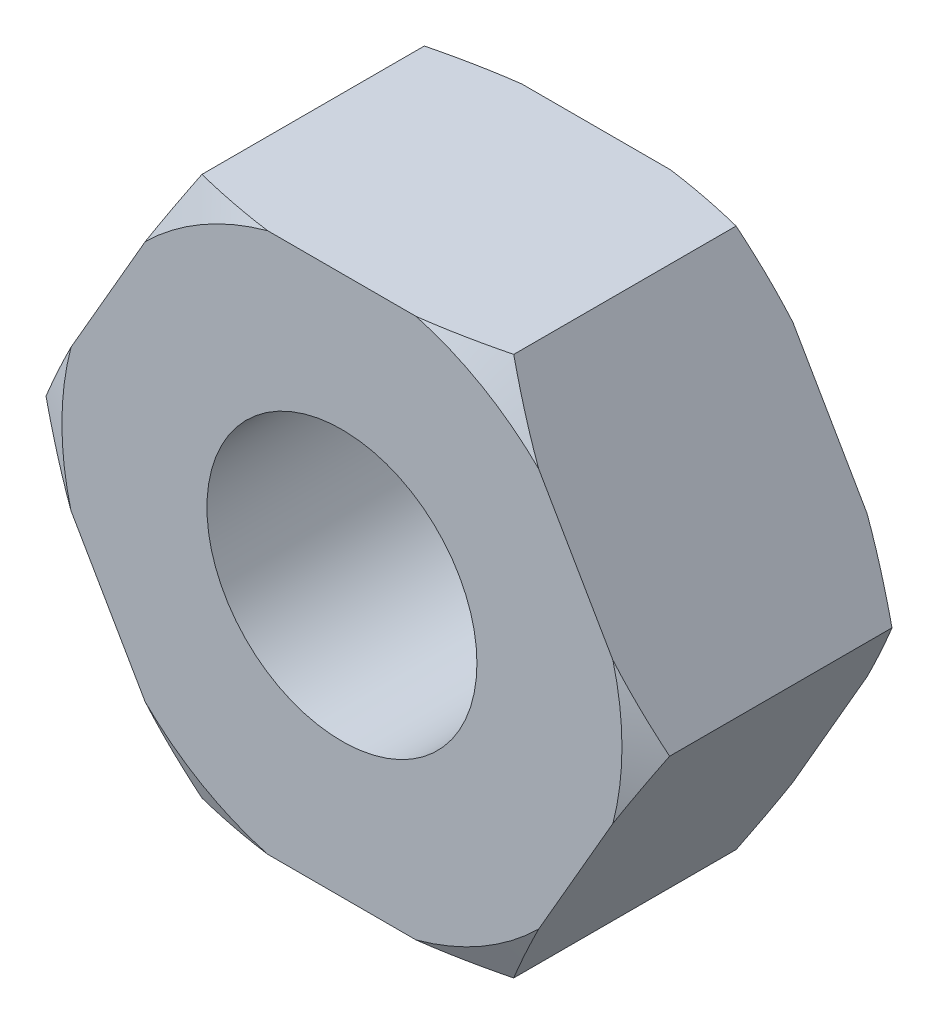
ISO-10303-21;
HEADER;
FILE_DESCRIPTION(('STEP AP214'),'2;1');
FILE_NAME('part.step','',(''),(''),'','','');
FILE_SCHEMA(('AUTOMOTIVE_DESIGN { 1 0 10303 214 1 1 1 1 }'));
ENDSEC;
DATA;
#1=APPLICATION_CONTEXT('core data for automotive mechanical design processes');
#2=APPLICATION_PROTOCOL_DEFINITION('international standard','automotive_design',2000,#1);
#3=PRODUCT_CONTEXT('',#1,'mechanical');
#4=PRODUCT('Part','Part','',(#3));
#5=PRODUCT_RELATED_PRODUCT_CATEGORY('part','',(#4));
#6=PRODUCT_DEFINITION_FORMATION('','',#4);
#7=PRODUCT_DEFINITION_CONTEXT('part definition',#1,'design');
#8=PRODUCT_DEFINITION('design','',#6,#7);
#9=PRODUCT_DEFINITION_SHAPE('','',#8);
#10=(LENGTH_UNIT() NAMED_UNIT(*) SI_UNIT(.MILLI.,.METRE.));
#11=(NAMED_UNIT(*) PLANE_ANGLE_UNIT() SI_UNIT($,.RADIAN.));
#12=(NAMED_UNIT(*) SI_UNIT($,.STERADIAN.) SOLID_ANGLE_UNIT());
#13=UNCERTAINTY_MEASURE_WITH_UNIT(LENGTH_MEASURE(1.E-05),#10,'distance_accuracy_value','');
#14=(GEOMETRIC_REPRESENTATION_CONTEXT(3) GLOBAL_UNCERTAINTY_ASSIGNED_CONTEXT((#13)) GLOBAL_UNIT_ASSIGNED_CONTEXT((#10,
#11,#12)) REPRESENTATION_CONTEXT('',''));
#15=CARTESIAN_POINT('',(0.,0.,0.));
#16=DIRECTION('',(0.,0.,1.));
#17=DIRECTION('',(1.,0.,0.));
#18=AXIS2_PLACEMENT_3D('',#15,#16,#17);
#19=CARTESIAN_POINT('',(0.,0.,8.));
#20=DIRECTION('',(0.,0.,1.));
#21=DIRECTION('',(1.,0.,0.));
#22=AXIS2_PLACEMENT_3D('',#19,#20,#21);
#23=PLANE('',#22);
#24=CARTESIAN_POINT('',(0.,0.,8.));
#25=DIRECTION('',(0.,0.,1.));
#26=DIRECTION('',(1.,0.,0.));
#27=AXIS2_PLACEMENT_3D('',#24,#25,#26);
#28=CIRCLE('',#27,4.25);
#29=CARTESIAN_POINT('',(4.25,0.,8.));
#30=VERTEX_POINT('',#29);
#31=EDGE_CURVE('E308',#30,#30,#28,.T.);
#32=ORIENTED_EDGE('',*,*,#31,.F.);
#33=EDGE_LOOP('',(#32));
#34=FACE_BOUND('',#33,.T.);
#35=CARTESIAN_POINT('',(0.,0.,8.00000000000001));
#36=DIRECTION('',(0.,0.,-1.));
#37=DIRECTION('',(-1.,0.,0.));
#38=AXIS2_PLACEMENT_3D('',#35,#36,#37);
#39=CIRCLE('',#38,8.81495457622364);
#40=CARTESIAN_POINT('',(6.19358754726888,-6.2723916870044,8.00000000000001));
#41=VERTEX_POINT('',#40);
#42=CARTESIAN_POINT('',(2.33525676979774,-8.50000000000001,8.));
#43=VERTEX_POINT('',#42);
#44=EDGE_CURVE('E174',#41,#43,#39,.T.);
#45=ORIENTED_EDGE('',*,*,#44,.F.);
#46=DIRECTION('',(0.5,0.866025403784439,0.));
#47=VECTOR('',#46,1.);
#48=CARTESIAN_POINT('',(4.90747728811182,-8.50000000000001,8.));
#49=LINE('',#48,#47);
#50=CARTESIAN_POINT('',(8.52884431706658,-2.2276083129956,8.00000000000001));
#51=VERTEX_POINT('',#50);
#52=EDGE_CURVE('E186',#41,#51,#49,.T.);
#53=ORIENTED_EDGE('',*,*,#52,.T.);
#54=CARTESIAN_POINT('',(8.52884431706658,2.22760831299561,8.00000000000001));
#55=VERTEX_POINT('',#54);
#56=EDGE_CURVE('E367',#55,#51,#39,.T.);
#57=ORIENTED_EDGE('',*,*,#56,.F.);
#58=DIRECTION('',(-0.5,0.866025403784439,0.));
#59=VECTOR('',#58,1.);
#60=CARTESIAN_POINT('',(9.81495457622364,0.,8.));
#61=LINE('',#60,#59);
#62=CARTESIAN_POINT('',(6.19358754726888,6.2723916870044,8.00000000000001));
#63=VERTEX_POINT('',#62);
#64=EDGE_CURVE('E317',#55,#63,#61,.T.);
#65=ORIENTED_EDGE('',*,*,#64,.T.);
#66=CARTESIAN_POINT('',(2.33525676979768,8.50000000000001,8.00000000000001));
#67=VERTEX_POINT('',#66);
#68=EDGE_CURVE('E364',#67,#63,#39,.T.);
#69=ORIENTED_EDGE('',*,*,#68,.F.);
#70=DIRECTION('',(-1.,0.,0.));
#71=VECTOR('',#70,1.);
#72=CARTESIAN_POINT('',(4.90747728811181,8.50000000000001,8.));
#73=LINE('',#72,#71);
#74=CARTESIAN_POINT('',(-2.33525676979769,8.50000000000001,8.));
#75=VERTEX_POINT('',#74);
#76=EDGE_CURVE('E320',#67,#75,#73,.T.);
#77=ORIENTED_EDGE('',*,*,#76,.T.);
#78=CARTESIAN_POINT('',(-6.19358754726888,6.27239168700441,8.));
#79=VERTEX_POINT('',#78);
#80=EDGE_CURVE('E357',#79,#75,#39,.T.);
#81=ORIENTED_EDGE('',*,*,#80,.F.);
#82=DIRECTION('',(-0.5,-0.866025403784439,0.));
#83=VECTOR('',#82,1.);
#84=CARTESIAN_POINT('',(-4.90747728811182,8.50000000000001,8.));
#85=LINE('',#84,#83);
#86=CARTESIAN_POINT('',(-8.52884431706659,2.22760831299559,8.));
#87=VERTEX_POINT('',#86);
#88=EDGE_CURVE('E323',#79,#87,#85,.T.);
#89=ORIENTED_EDGE('',*,*,#88,.T.);
#90=CARTESIAN_POINT('',(-8.5288443170666,-2.22760831299559,8.));
#91=VERTEX_POINT('',#90);
#92=EDGE_CURVE('E359',#91,#87,#39,.T.);
#93=ORIENTED_EDGE('',*,*,#92,.F.);
#94=DIRECTION('',(0.5,-0.866025403784439,0.));
#95=VECTOR('',#94,1.);
#96=CARTESIAN_POINT('',(-9.81495457622365,0.,8.));
#97=LINE('',#96,#95);
#98=CARTESIAN_POINT('',(-6.19358754726887,-6.27239168700442,8.));
#99=VERTEX_POINT('',#98);
#100=EDGE_CURVE('E199',#91,#99,#97,.T.);
#101=ORIENTED_EDGE('',*,*,#100,.T.);
#102=CARTESIAN_POINT('',(-2.33525676979771,-8.50000000000001,8.));
#103=VERTEX_POINT('',#102);
#104=EDGE_CURVE('E360',#103,#99,#39,.T.);
#105=ORIENTED_EDGE('',*,*,#104,.F.);
#106=DIRECTION('',(1.,0.,0.));
#107=VECTOR('',#106,1.);
#108=CARTESIAN_POINT('',(-4.90747728811182,-8.50000000000001,8.));
#109=LINE('',#108,#107);
#110=EDGE_CURVE('E195',#103,#43,#109,.T.);
#111=ORIENTED_EDGE('',*,*,#110,.T.);
#112=EDGE_LOOP('',(#45,#53,#57,#65,#69,#77,#81,#89,#93,#101,#105,#111));
#113=FACE_BOUND('',#112,.T.);
#114=ADVANCED_FACE('F38',(#34,#113),#23,.T.);
#115=CARTESIAN_POINT('',(0.,0.,0.));
#116=DIRECTION('',(0.,0.,1.));
#117=DIRECTION('',(1.,0.,0.));
#118=AXIS2_PLACEMENT_3D('',#115,#116,#117);
#119=PLANE('',#118);
#120=CARTESIAN_POINT('',(0.,0.,0.));
#121=DIRECTION('',(0.,0.,1.));
#122=DIRECTION('',(1.,0.,0.));
#123=AXIS2_PLACEMENT_3D('',#120,#121,#122);
#124=CIRCLE('',#123,4.25);
#125=CARTESIAN_POINT('',(4.25,0.,0.));
#126=VERTEX_POINT('',#125);
#127=EDGE_CURVE('E312',#126,#126,#124,.T.);
#128=ORIENTED_EDGE('',*,*,#127,.T.);
#129=EDGE_LOOP('',(#128));
#130=FACE_BOUND('',#129,.T.);
#131=DIRECTION('',(0.5,0.866025403784439,0.));
#132=VECTOR('',#131,1.);
#133=CARTESIAN_POINT('',(4.90747728811182,-8.50000000000001,0.));
#134=LINE('',#133,#132);
#135=CARTESIAN_POINT('',(6.19358754726887,-6.27239168700442,0.));
#136=VERTEX_POINT('',#135);
#137=CARTESIAN_POINT('',(8.5288443170666,-2.22760831299558,0.));
#138=VERTEX_POINT('',#137);
#139=EDGE_CURVE('E311',#136,#138,#134,.T.);
#140=ORIENTED_EDGE('',*,*,#139,.F.);
#141=CARTESIAN_POINT('',(0.,0.,0.));
#142=DIRECTION('',(0.,0.,-1.));
#143=DIRECTION('',(-1.,0.,0.));
#144=AXIS2_PLACEMENT_3D('',#141,#142,#143);
#145=CIRCLE('',#144,8.81495457622364);
#146=CARTESIAN_POINT('',(2.33525676979771,-8.50000000000001,0.));
#147=VERTEX_POINT('',#146);
#148=EDGE_CURVE('E351',#136,#147,#145,.T.);
#149=ORIENTED_EDGE('',*,*,#148,.T.);
#150=DIRECTION('',(1.,0.,0.));
#151=VECTOR('',#150,1.);
#152=CARTESIAN_POINT('',(-4.90747728811182,-8.50000000000001,0.));
#153=LINE('',#152,#151);
#154=CARTESIAN_POINT('',(-2.33525676979769,-8.50000000000001,0.));
#155=VERTEX_POINT('',#154);
#156=EDGE_CURVE('E202',#155,#147,#153,.T.);
#157=ORIENTED_EDGE('',*,*,#156,.F.);
#158=CARTESIAN_POINT('',(-6.19358754726888,-6.27239168700441,0.));
#159=VERTEX_POINT('',#158);
#160=EDGE_CURVE('E350',#155,#159,#145,.T.);
#161=ORIENTED_EDGE('',*,*,#160,.T.);
#162=DIRECTION('',(0.5,-0.866025403784439,0.));
#163=VECTOR('',#162,1.);
#164=CARTESIAN_POINT('',(-9.81495457622365,0.,0.));
#165=LINE('',#164,#163);
#166=CARTESIAN_POINT('',(-8.52884431706659,-2.2276083129956,0.));
#167=VERTEX_POINT('',#166);
#168=EDGE_CURVE('E338',#167,#159,#165,.T.);
#169=ORIENTED_EDGE('',*,*,#168,.F.);
#170=CARTESIAN_POINT('',(-8.52884431706659,2.22760831299559,0.));
#171=VERTEX_POINT('',#170);
#172=EDGE_CURVE('E355',#167,#171,#145,.T.);
#173=ORIENTED_EDGE('',*,*,#172,.T.);
#174=DIRECTION('',(-0.5,-0.866025403784439,0.));
#175=VECTOR('',#174,1.);
#176=CARTESIAN_POINT('',(-4.90747728811182,8.50000000000001,0.));
#177=LINE('',#176,#175);
#178=CARTESIAN_POINT('',(-6.19358754726889,6.2723916870044,0.));
#179=VERTEX_POINT('',#178);
#180=EDGE_CURVE('E336',#179,#171,#177,.T.);
#181=ORIENTED_EDGE('',*,*,#180,.F.);
#182=CARTESIAN_POINT('',(-2.3352567697977,8.50000000000001,0.));
#183=VERTEX_POINT('',#182);
#184=EDGE_CURVE('E358',#179,#183,#145,.T.);
#185=ORIENTED_EDGE('',*,*,#184,.T.);
#186=DIRECTION('',(-1.,0.,0.));
#187=VECTOR('',#186,1.);
#188=CARTESIAN_POINT('',(4.90747728811181,8.50000000000001,0.));
#189=LINE('',#188,#187);
#190=CARTESIAN_POINT('',(2.33525676979765,8.50000000000001,0.));
#191=VERTEX_POINT('',#190);
#192=EDGE_CURVE('E333',#191,#183,#189,.T.);
#193=ORIENTED_EDGE('',*,*,#192,.F.);
#194=CARTESIAN_POINT('',(6.19358754726887,6.27239168700442,0.));
#195=VERTEX_POINT('',#194);
#196=EDGE_CURVE('E354',#191,#195,#145,.T.);
#197=ORIENTED_EDGE('',*,*,#196,.T.);
#198=DIRECTION('',(-0.5,0.866025403784439,0.));
#199=VECTOR('',#198,1.);
#200=CARTESIAN_POINT('',(9.81495457622364,0.,0.));
#201=LINE('',#200,#199);
#202=CARTESIAN_POINT('',(8.52884431706656,2.22760831299563,0.));
#203=VERTEX_POINT('',#202);
#204=EDGE_CURVE('E330',#203,#195,#201,.T.);
#205=ORIENTED_EDGE('',*,*,#204,.F.);
#206=EDGE_CURVE('E68',#203,#138,#145,.T.);
#207=ORIENTED_EDGE('',*,*,#206,.T.);
#208=EDGE_LOOP('',(#140,#149,#157,#161,#169,#173,#181,#185,#193,#197,#205,#207));
#209=FACE_BOUND('',#208,.T.);
#210=ADVANCED_FACE('F349',(#130,#209),#119,.F.);
#211=CARTESIAN_POINT('',(4.90747728811182,-8.50000000000001,8.));
#212=DIRECTION('',(-0.866025403784439,0.5,0.));
#213=DIRECTION('',(-0.5,-0.866025403784439,0.));
#214=AXIS2_PLACEMENT_3D('',#211,#212,#213);
#215=PLANE('',#214);
#216=DIRECTION('',(0.,0.,-1.));
#217=VECTOR('',#216,1.);
#218=CARTESIAN_POINT('',(4.90747728811182,-8.50000000000001,8.));
#219=LINE('',#218,#217);
#220=CARTESIAN_POINT('',(4.90747728811181,-8.50000000000001,7.50000000000001));
#221=VERTEX_POINT('',#220);
#222=CARTESIAN_POINT('',(4.90747728811182,-8.50000000000001,0.500000000000008));
#223=VERTEX_POINT('',#222);
#224=EDGE_CURVE('E184',#221,#223,#219,.T.);
#225=ORIENTED_EDGE('',*,*,#224,.T.);
#226=CARTESIAN_POINT('',(4.90707314292339,-8.50070000000001,0.500202085074665));
#227=CARTESIAN_POINT('',(5.04539648047619,-8.26111695148605,0.431037001478405));
#228=CARTESIAN_POINT('',(5.18425872801668,-8.02060048349272,0.365975934098768));
#229=CARTESIAN_POINT('',(5.46308933900149,-7.53765169856155,0.245431881458199));
#230=CARTESIAN_POINT('',(5.60305823357743,-7.29521846167677,0.189953829261579));
#231=CARTESIAN_POINT('',(5.88419637238107,-6.80827292132352,0.0899457379592984));
#232=CARTESIAN_POINT('',(6.02536708724475,-6.56375807063879,0.0454320334196543));
#233=CARTESIAN_POINT('',(6.30853248030509,-6.07330122291309,-0.0311688340336334));
#234=CARTESIAN_POINT('',(6.45052701218298,-5.82735947930363,-0.0632581389788533));
#235=CARTESIAN_POINT('',(6.73189823105368,-5.34001023243198,-0.11331637906808));
#236=CARTESIAN_POINT('',(6.87126127251055,-5.09862636393136,-0.131588987679449));
#237=CARTESIAN_POINT('',(7.15027760794049,-4.61535589482501,-0.154517426261992));
#238=CARTESIAN_POINT('',(7.28993091588691,-4.37346927001675,-0.159172584752798));
#239=CARTESIAN_POINT('',(7.56903063475875,-3.89005437655254,-0.154685571909243));
#240=CARTESIAN_POINT('',(7.70847710644293,-3.64852600265932,-0.14555826683455));
#241=CARTESIAN_POINT('',(7.98697270856631,-3.16615747009714,-0.113885574611613));
#242=CARTESIAN_POINT('',(8.12602187186108,-2.92531725452065,-0.0913413312657181));
#243=CARTESIAN_POINT('',(8.39475560713558,-2.45985677131747,-0.0354617719109811));
#244=CARTESIAN_POINT('',(8.5244805500039,-2.23516657926055,-0.00289193103305048));
#245=CARTESIAN_POINT('',(8.78320155681667,-1.78704865047547,0.0723911259197453));
#246=CARTESIAN_POINT('',(8.91219754131855,-1.56362105134584,0.11510542652468));
#247=CARTESIAN_POINT('',(9.17078093553375,-1.1157414745715,0.210140846061151));
#248=CARTESIAN_POINT('',(9.30035889198646,-0.891305870454461,0.262563810605358));
#249=CARTESIAN_POINT('',(9.55856371514588,-0.444081997983018,0.375552841414268));
#250=CARTESIAN_POINT('',(9.6871909974297,-0.221293009827922,0.436115096597846));
#251=CARTESIAN_POINT('',(9.81535872141207,0.000700000000001366,0.500202085074664));
#252=B_SPLINE_CURVE_WITH_KNOTS('',3,(#226,#227,#228,#229,#230,#231,#232,#233,#234,#235,#236,
#237,#238,#239,#240,#241,#242,#243,#244,#245,#246,#247,#248,#249,#250,#251),.UNSPECIFIED.,.F.,
.F.,(4,2,2,2,2,2,2,2,2,2,2,2,4),(0.,0.855528802068651,1.71149670206994,2.5687322038918,
3.42581984794331,4.26347350481425,5.10116846593084,5.93796050441603,6.774681216075,
7.55892436859344,8.34325140122732,9.13632729979293,9.92903313979551),.UNSPECIFIED.);
#253=EDGE_CURVE('E377',#223,#136,#252,.T.);
#254=ORIENTED_EDGE('',*,*,#253,.T.);
#255=ORIENTED_EDGE('',*,*,#139,.T.);
#256=CARTESIAN_POINT('',(9.81495457622365,0.,0.500000000000011));
#257=VERTEX_POINT('',#256);
#258=EDGE_CURVE('E315',#138,#257,#252,.T.);
#259=ORIENTED_EDGE('',*,*,#258,.T.);
#260=DIRECTION('',(0.,0.,-1.));
#261=VECTOR('',#260,1.);
#262=CARTESIAN_POINT('',(9.81495457622364,0.,8.));
#263=LINE('',#262,#261);
#264=CARTESIAN_POINT('',(9.81495457622364,0.,7.50000000000001));
#265=VERTEX_POINT('',#264);
#266=EDGE_CURVE('E213',#265,#257,#263,.T.);
#267=ORIENTED_EDGE('',*,*,#266,.F.);
#268=CARTESIAN_POINT('',(9.81535872141207,0.000700000000001828,7.49979791492535));
#269=CARTESIAN_POINT('',(9.67703538385927,-0.238883048513955,7.56896299852161));
#270=CARTESIAN_POINT('',(9.53817313631878,-0.479399516507294,7.63402406590125));
#271=CARTESIAN_POINT('',(9.25934252533396,-0.962348301438463,7.75456811854182));
#272=CARTESIAN_POINT('',(9.11937363075803,-1.20478153832324,7.81004617073844));
#273=CARTESIAN_POINT('',(8.83823549195439,-1.69172707867649,7.91005426204072));
#274=CARTESIAN_POINT('',(8.6970647770907,-1.93624192936122,7.95456796658036));
#275=CARTESIAN_POINT('',(8.41389938403037,-2.42669877708692,8.03116883403365));
#276=CARTESIAN_POINT('',(8.27190485215248,-2.67264052069639,8.06325813897887));
#277=CARTESIAN_POINT('',(7.99053363328177,-3.15998976756804,8.1133163790681));
#278=CARTESIAN_POINT('',(7.8511705918249,-3.40137363606866,8.13158898767946));
#279=CARTESIAN_POINT('',(7.57215425639496,-3.884644105175,8.15451742626201));
#280=CARTESIAN_POINT('',(7.43250094844854,-4.12653072998326,8.15917258475281));
#281=CARTESIAN_POINT('',(7.1534012295767,-4.60994562344748,8.15468557190925));
#282=CARTESIAN_POINT('',(7.01395475789252,-4.85147399734069,8.14555826683456));
#283=CARTESIAN_POINT('',(6.73545915576914,-5.33384252990287,8.11388557461163));
#284=CARTESIAN_POINT('',(6.59640999247437,-5.57468274547936,8.09134133126573));
#285=CARTESIAN_POINT('',(6.32767625719988,-6.04014322868255,8.03546177191099));
#286=CARTESIAN_POINT('',(6.19795131433155,-6.26483342073946,8.00289193103306));
#287=CARTESIAN_POINT('',(5.93923030751878,-6.71295134952454,7.92760887408026));
#288=CARTESIAN_POINT('',(5.8102343230169,-6.93637894865417,7.88489457347533));
#289=CARTESIAN_POINT('',(5.5516509288017,-7.38425852542851,7.78985915393886));
#290=CARTESIAN_POINT('',(5.42207297234899,-7.60869412954555,7.73743618939465));
#291=CARTESIAN_POINT('',(5.16386814918958,-8.05591800201699,7.62444715858574));
#292=CARTESIAN_POINT('',(5.03524086690575,-8.27870699017208,7.56388490340217));
#293=CARTESIAN_POINT('',(4.90707314292339,-8.50070000000001,7.49979791492535));
#294=B_SPLINE_CURVE_WITH_KNOTS('',3,(#268,#269,#270,#271,#272,#273,#274,#275,#276,#277,#278,
#279,#280,#281,#282,#283,#284,#285,#286,#287,#288,#289,#290,#291,#292,#293),.UNSPECIFIED.,.F.,
.F.,(4,2,2,2,2,2,2,2,2,2,2,2,4),(0.,0.855528802068653,1.71149670206994,2.56873220389181,
3.42581984794332,4.26347350481426,5.10116846593085,5.93796050441604,6.77468121607501,
7.55892436859345,8.34325140122732,9.13632729979293,9.92903313979551),.UNSPECIFIED.);
#295=EDGE_CURVE('E60',#265,#51,#294,.T.);
#296=ORIENTED_EDGE('',*,*,#295,.T.);
#297=ORIENTED_EDGE('',*,*,#52,.F.);
#298=EDGE_CURVE('E172',#41,#221,#294,.T.);
#299=ORIENTED_EDGE('',*,*,#298,.T.);
#300=EDGE_LOOP('',(#225,#254,#255,#259,#267,#296,#297,#299));
#301=FACE_BOUND('',#300,.T.);
#302=ADVANCED_FACE('F40',(#301),#215,.F.);
#303=CARTESIAN_POINT('',(9.81495457622364,0.,8.));
#304=DIRECTION('',(-0.866025403784439,-0.5,0.));
#305=DIRECTION('',(0.5,-0.866025403784439,0.));
#306=AXIS2_PLACEMENT_3D('',#303,#304,#305);
#307=PLANE('',#306);
#308=ORIENTED_EDGE('',*,*,#266,.T.);
#309=CARTESIAN_POINT('',(9.81535872141207,-0.000699999999998351,0.500202085074664));
#310=CARTESIAN_POINT('',(9.67703538385927,0.238883048513958,0.431037001478405));
#311=CARTESIAN_POINT('',(9.53817313631878,0.479399516507295,0.365975934098768));
#312=CARTESIAN_POINT('',(9.25934252533396,0.962348301438462,0.245431881458198));
#313=CARTESIAN_POINT('',(9.11937363075803,1.20478153832324,0.189953829261578));
#314=CARTESIAN_POINT('',(8.83823549195439,1.69172707867649,0.0899457379592977));
#315=CARTESIAN_POINT('',(8.6970647770907,1.93624192936121,0.0454320334196541));
#316=CARTESIAN_POINT('',(8.41389938403037,2.42669877708692,-0.0311688340336332));
#317=CARTESIAN_POINT('',(8.27190485215248,2.67264052069638,-0.0632581389788531));
#318=CARTESIAN_POINT('',(7.99053363328178,3.15998976756803,-0.11331637906808));
#319=CARTESIAN_POINT('',(7.85117059182491,3.40137363606865,-0.131588987679449));
#320=CARTESIAN_POINT('',(7.57215425639497,3.88464410517499,-0.154517426261992));
#321=CARTESIAN_POINT('',(7.43250094844855,4.12653072998325,-0.159172584752798));
#322=CARTESIAN_POINT('',(7.15340122957671,4.60994562344746,-0.154685571909243));
#323=CARTESIAN_POINT('',(7.01395475789253,4.85147399734068,-0.145558266834551));
#324=CARTESIAN_POINT('',(6.73545915576915,5.33384252990286,-0.113885574611614));
#325=CARTESIAN_POINT('',(6.59640999247438,5.57468274547935,-0.0913413312657193));
#326=CARTESIAN_POINT('',(6.32767625719988,6.04014322868254,-0.0354617719109822));
#327=CARTESIAN_POINT('',(6.19795131433155,6.26483342073945,-0.00289193103305128));
#328=CARTESIAN_POINT('',(5.93923030751879,6.71295134952454,0.072391125919745));
#329=CARTESIAN_POINT('',(5.81023432301691,6.93637894865416,0.11510542652468));
#330=CARTESIAN_POINT('',(5.5516509288017,7.38425852542851,0.210140846061152));
#331=CARTESIAN_POINT('',(5.42207297234899,7.60869412954555,0.262563810605359));
#332=CARTESIAN_POINT('',(5.16386814918958,8.05591800201699,0.37555284141427));
#333=CARTESIAN_POINT('',(5.03524086690575,8.27870699017209,0.436115096597847));
#334=CARTESIAN_POINT('',(4.90707314292338,8.50070000000001,0.500202085074665));
#335=B_SPLINE_CURVE_WITH_KNOTS('',3,(#309,#310,#311,#312,#313,#314,#315,#316,#317,#318,#319,
#320,#321,#322,#323,#324,#325,#326,#327,#328,#329,#330,#331,#332,#333,#334),.UNSPECIFIED.,.F.,
.F.,(4,2,2,2,2,2,2,2,2,2,2,2,4),(0.,0.855528802068652,1.71149670206994,2.5687322038918,
3.42581984794331,4.26347350481424,5.10116846593083,5.93796050441602,6.77468121607499,
7.55892436859343,8.34325140122732,9.13632729979293,9.92903313979551),.UNSPECIFIED.);
#336=EDGE_CURVE('E307',#257,#203,#335,.T.);
#337=ORIENTED_EDGE('',*,*,#336,.T.);
#338=ORIENTED_EDGE('',*,*,#204,.T.);
#339=CARTESIAN_POINT('',(4.90747728811181,8.50000000000001,0.500000000000008));
#340=VERTEX_POINT('',#339);
#341=EDGE_CURVE('E300',#195,#340,#335,.T.);
#342=ORIENTED_EDGE('',*,*,#341,.T.);
#343=DIRECTION('',(0.,0.,-1.));
#344=VECTOR('',#343,1.);
#345=CARTESIAN_POINT('',(4.90747728811181,8.50000000000001,8.));
#346=LINE('',#345,#344);
#347=CARTESIAN_POINT('',(4.90747728811181,8.50000000000001,7.50000000000001));
#348=VERTEX_POINT('',#347);
#349=EDGE_CURVE('E210',#348,#340,#346,.T.);
#350=ORIENTED_EDGE('',*,*,#349,.F.);
#351=CARTESIAN_POINT('',(4.90707314292338,8.50070000000001,7.49979791492535));
#352=CARTESIAN_POINT('',(5.04539648047618,8.26111695148606,7.56896299852161));
#353=CARTESIAN_POINT('',(5.18425872801668,8.02060048349272,7.63402406590125));
#354=CARTESIAN_POINT('',(5.46308933900149,7.53765169856155,7.75456811854181));
#355=CARTESIAN_POINT('',(5.60305823357743,7.29521846167678,7.81004617073843));
#356=CARTESIAN_POINT('',(5.88419637238107,6.80827292132352,7.91005426204072));
#357=CARTESIAN_POINT('',(6.02536708724475,6.56375807063879,7.95456796658036));
#358=CARTESIAN_POINT('',(6.30853248030509,6.07330122291309,8.03116883403365));
#359=CARTESIAN_POINT('',(6.45052701218297,5.82735947930362,8.06325813897887));
#360=CARTESIAN_POINT('',(6.73189823105368,5.34001023243197,8.11331637906809));
#361=CARTESIAN_POINT('',(6.87126127251055,5.09862636393135,8.13158898767946));
#362=CARTESIAN_POINT('',(7.1502776079405,4.61535589482501,8.15451742626201));
#363=CARTESIAN_POINT('',(7.28993091588692,4.37346927001675,8.15917258475281));
#364=CARTESIAN_POINT('',(7.56903063475875,3.89005437655253,8.15468557190926));
#365=CARTESIAN_POINT('',(7.70847710644294,3.64852600265931,8.14555826683456));
#366=CARTESIAN_POINT('',(7.98697270856632,3.16615747009713,8.11388557461163));
#367=CARTESIAN_POINT('',(8.12602187186109,2.92531725452064,8.09134133126573));
#368=CARTESIAN_POINT('',(8.39475560713558,2.45985677131746,8.03546177191099));
#369=CARTESIAN_POINT('',(8.52448055000391,2.23516657926054,8.00289193103306));
#370=CARTESIAN_POINT('',(8.78320155681667,1.78704865047546,7.92760887408027));
#371=CARTESIAN_POINT('',(8.91219754131856,1.56362105134584,7.88489457347533));
#372=CARTESIAN_POINT('',(9.17078093553376,1.1157414745715,7.78985915393886));
#373=CARTESIAN_POINT('',(9.30035889198647,0.891305870454458,7.73743618939466));
#374=CARTESIAN_POINT('',(9.55856371514588,0.444081997983018,7.62444715858575));
#375=CARTESIAN_POINT('',(9.6871909974297,0.221293009827924,7.56388490340217));
#376=CARTESIAN_POINT('',(9.81535872141207,-0.000699999999997686,7.49979791492535));
#377=B_SPLINE_CURVE_WITH_KNOTS('',3,(#351,#352,#353,#354,#355,#356,#357,#358,#359,#360,#361,
#362,#363,#364,#365,#366,#367,#368,#369,#370,#371,#372,#373,#374,#375,#376),.UNSPECIFIED.,.F.,
.F.,(4,2,2,2,2,2,2,2,2,2,2,2,4),(0.,0.855528802068654,1.71149670206994,2.56873220389181,
3.42581984794332,4.26347350481426,5.10116846593085,5.93796050441604,6.77468121607501,
7.55892436859345,8.34325140122733,9.13632729979294,9.92903313979551),.UNSPECIFIED.);
#378=EDGE_CURVE('E268',#348,#63,#377,.T.);
#379=ORIENTED_EDGE('',*,*,#378,.T.);
#380=ORIENTED_EDGE('',*,*,#64,.F.);
#381=EDGE_CURVE('E372',#55,#265,#377,.T.);
#382=ORIENTED_EDGE('',*,*,#381,.T.);
#383=EDGE_LOOP('',(#308,#337,#338,#342,#350,#379,#380,#382));
#384=FACE_BOUND('',#383,.T.);
#385=ADVANCED_FACE('F278',(#384),#307,.F.);
#386=CARTESIAN_POINT('',(4.90747728811181,8.50000000000001,8.));
#387=DIRECTION('',(0.,-1.,0.));
#388=DIRECTION('',(0.,0.,-1.));
#389=AXIS2_PLACEMENT_3D('',#386,#387,#388);
#390=PLANE('',#389);
#391=ORIENTED_EDGE('',*,*,#349,.T.);
#392=CARTESIAN_POINT('',(4.90817728811181,8.50000000000001,0.50017500936039));
#393=CARTESIAN_POINT('',(4.63153297287085,8.50000000000001,0.431011657936865));
#394=CARTESIAN_POINT('',(4.35381085298519,8.50000000000001,0.365952333331771));
#395=CARTESIAN_POINT('',(3.79615443140124,8.50000000000001,0.245411752584152));
#396=CARTESIAN_POINT('',(3.51621906749015,8.50000000000001,0.189935429371374));
#397=CARTESIAN_POINT('',(2.95394774515312,8.50000000000001,0.0899307536760318));
#398=CARTESIAN_POINT('',(2.6716088458373,8.50000000000001,0.0454187340508971));
#399=CARTESIAN_POINT('',(2.10528319137799,8.50000000000001,-0.0311788747579813));
#400=CARTESIAN_POINT('',(1.82129672885464,8.50000000000001,-0.0632666059180051));
#401=CARTESIAN_POINT('',(1.2585593400707,8.50000000000001,-0.113321921768315));
#402=CARTESIAN_POINT('',(0.979835702467513,8.50000000000001,-0.131593168118277));
#403=CARTESIAN_POINT('',(0.421807987758644,8.50000000000001,-0.154519091648003));
#404=CARTESIAN_POINT('',(0.142503882708575,8.50000000000001,-0.15917309733495));
#405=CARTESIAN_POINT('',(-0.415690501822819,8.50000000000001,-0.154684037284004));
#406=CARTESIAN_POINT('',(-0.694580902869382,8.50000000000001,-0.145555836737074));
#407=CARTESIAN_POINT('',(-1.25156699533499,8.50000000000001,-0.113881635828803));
#408=CARTESIAN_POINT('',(-1.52966275246908,8.50000000000001,-0.0913367792735685));
#409=CARTESIAN_POINT('',(-2.06711447651764,8.50000000000001,-0.0354574283468566));
#410=CARTESIAN_POINT('',(-2.32655123389441,8.50000000000001,-0.00288884985926005));
#411=CARTESIAN_POINT('',(-2.84396712632329,8.50000000000001,0.0723906454721076));
#412=CARTESIAN_POINT('',(-3.10194610257542,8.50000000000001,0.115102646262996));
#413=CARTESIAN_POINT('',(-3.61908674231791,8.50000000000001,0.210132526511789));
#414=CARTESIAN_POINT('',(-3.87822950256329,8.50000000000001,0.262552234801547));
#415=CARTESIAN_POINT('',(-4.3946130585449,8.50000000000001,0.375534022020316));
#416=CARTESIAN_POINT('',(-4.65185468518219,8.50000000000001,0.436092290978486));
#417=CARTESIAN_POINT('',(-4.90817728811182,8.50000000000001,0.500175009360387));
#418=B_SPLINE_CURVE_WITH_KNOTS('',3,(#392,#393,#394,#395,#396,#397,#398,#399,#400,#401,#402,
#403,#404,#405,#406,#407,#408,#409,#410,#411,#412,#413,#414,#415,#416,#417),.UNSPECIFIED.,.F.,
.F.,(4,2,2,2,2,2,2,2,2,2,2,2,4),(0.,0.855520671645643,1.71148042577708,2.5687076431805,
3.42578700674064,4.26343308200268,5.10112046253775,5.93790497670449,6.77461816295227,
7.55882180151691,8.34310927944532,9.13614458520283,9.92880992573495),.UNSPECIFIED.);
#419=EDGE_CURVE('E292',#340,#191,#418,.T.);
#420=ORIENTED_EDGE('',*,*,#419,.T.);
#421=ORIENTED_EDGE('',*,*,#192,.T.);
#422=CARTESIAN_POINT('',(-4.90747728811183,8.5,0.500000000000003));
#423=VERTEX_POINT('',#422);
#424=EDGE_CURVE('E284',#183,#423,#418,.T.);
#425=ORIENTED_EDGE('',*,*,#424,.T.);
#426=DIRECTION('',(0.,0.,-1.));
#427=VECTOR('',#426,1.);
#428=CARTESIAN_POINT('',(-4.90747728811182,8.50000000000001,8.));
#429=LINE('',#428,#427);
#430=CARTESIAN_POINT('',(-4.90747728811182,8.50000000000001,7.5));
#431=VERTEX_POINT('',#430);
#432=EDGE_CURVE('E207',#431,#423,#429,.T.);
#433=ORIENTED_EDGE('',*,*,#432,.F.);
#434=CARTESIAN_POINT('',(-4.90817728811182,8.50000000000001,7.49982499063962));
#435=CARTESIAN_POINT('',(-4.63153297287086,8.50000000000001,7.56898834206314));
#436=CARTESIAN_POINT('',(-4.3538108529852,8.50000000000001,7.63404766666824));
#437=CARTESIAN_POINT('',(-3.79615443140125,8.50000000000001,7.75458824741586));
#438=CARTESIAN_POINT('',(-3.51621906749015,8.50000000000001,7.81006457062863));
#439=CARTESIAN_POINT('',(-2.95394774515312,8.50000000000001,7.91006924632398));
#440=CARTESIAN_POINT('',(-2.6716088458373,8.50000000000001,7.95458126594911));
#441=CARTESIAN_POINT('',(-2.105283191378,8.50000000000001,8.03117887475799));
#442=CARTESIAN_POINT('',(-1.82129672885464,8.50000000000001,8.06326660591801));
#443=CARTESIAN_POINT('',(-1.2585593400707,8.50000000000001,8.11332192176832));
#444=CARTESIAN_POINT('',(-0.979835702467512,8.50000000000001,8.13159316811828));
#445=CARTESIAN_POINT('',(-0.421807987758642,8.50000000000001,8.15451909164801));
#446=CARTESIAN_POINT('',(-0.142503882708572,8.50000000000001,8.15917309733496));
#447=CARTESIAN_POINT('',(0.415690501822822,8.50000000000001,8.15468403728401));
#448=CARTESIAN_POINT('',(0.694580902869386,8.50000000000001,8.14555583673708));
#449=CARTESIAN_POINT('',(1.251566995335,8.50000000000001,8.11388163582881));
#450=CARTESIAN_POINT('',(1.52966275246908,8.50000000000001,8.09133677927357));
#451=CARTESIAN_POINT('',(2.06711447651765,8.50000000000001,8.03545742834686));
#452=CARTESIAN_POINT('',(2.32655123389441,8.50000000000001,8.00288884985927));
#453=CARTESIAN_POINT('',(2.8439671263233,8.50000000000001,7.9276093545279));
#454=CARTESIAN_POINT('',(3.10194610257542,8.50000000000001,7.88489735373701));
#455=CARTESIAN_POINT('',(3.61908674231791,8.50000000000001,7.78986747348822));
#456=CARTESIAN_POINT('',(3.87822950256329,8.50000000000001,7.73744776519846));
#457=CARTESIAN_POINT('',(4.3946130585449,8.50000000000001,7.62446597797969));
#458=CARTESIAN_POINT('',(4.65185468518219,8.50000000000001,7.56390770902152));
#459=CARTESIAN_POINT('',(4.90817728811181,8.50000000000001,7.49982499063962));
#460=B_SPLINE_CURVE_WITH_KNOTS('',3,(#434,#435,#436,#437,#438,#439,#440,#441,#442,#443,#444,
#445,#446,#447,#448,#449,#450,#451,#452,#453,#454,#455,#456,#457,#458,#459),.UNSPECIFIED.,.F.,
.F.,(4,2,2,2,2,2,2,2,2,2,2,2,4),(0.,0.855520671645646,1.71148042577708,2.5687076431805,
3.42578700674065,4.26343308200269,5.10112046253776,5.93790497670451,6.77461816295229,
7.55882180151693,8.34310927944533,9.13614458520284,9.92880992573495),.UNSPECIFIED.);
#461=EDGE_CURVE('E259',#431,#75,#460,.T.);
#462=ORIENTED_EDGE('',*,*,#461,.T.);
#463=ORIENTED_EDGE('',*,*,#76,.F.);
#464=EDGE_CURVE('E266',#67,#348,#460,.T.);
#465=ORIENTED_EDGE('',*,*,#464,.T.);
#466=EDGE_LOOP('',(#391,#420,#421,#425,#433,#462,#463,#465));
#467=FACE_BOUND('',#466,.T.);
#468=ADVANCED_FACE('F274',(#467),#390,.F.);
#469=CARTESIAN_POINT('',(-4.90747728811182,8.50000000000001,8.));
#470=DIRECTION('',(0.866025403784439,-0.5,0.));
#471=DIRECTION('',(0.5,0.866025403784439,0.));
#472=AXIS2_PLACEMENT_3D('',#469,#470,#471);
#473=PLANE('',#472);
#474=ORIENTED_EDGE('',*,*,#432,.T.);
#475=CARTESIAN_POINT('',(-4.90707314292339,8.50070000000001,0.500202085074662));
#476=CARTESIAN_POINT('',(-5.04539648047619,8.26111695148606,0.431037001478403));
#477=CARTESIAN_POINT('',(-5.18425872801669,8.02060048349272,0.365975934098766));
#478=CARTESIAN_POINT('',(-5.4630893390015,7.53765169856155,0.245431881458196));
#479=CARTESIAN_POINT('',(-5.60305823357743,7.29521846167678,0.189953829261575));
#480=CARTESIAN_POINT('',(-5.88419637238107,6.80827292132352,0.0899457379592945));
#481=CARTESIAN_POINT('',(-6.02536708724476,6.5637580706388,0.0454320334196504));
#482=CARTESIAN_POINT('',(-6.30853248030509,6.07330122291309,-0.031168834033637));
#483=CARTESIAN_POINT('',(-6.45052701218298,5.82735947930363,-0.0632581389788566));
#484=CARTESIAN_POINT('',(-6.73189823105369,5.34001023243198,-0.113316379068084));
#485=CARTESIAN_POINT('',(-6.87126127251055,5.09862636393136,-0.131588987679453));
#486=CARTESIAN_POINT('',(-7.1502776079405,4.61535589482502,-0.154517426261997));
#487=CARTESIAN_POINT('',(-7.28993091588692,4.37346927001675,-0.159172584752804));
#488=CARTESIAN_POINT('',(-7.56903063475876,3.89005437655254,-0.154685571909249));
#489=CARTESIAN_POINT('',(-7.70847710644294,3.64852600265932,-0.145558266834556));
#490=CARTESIAN_POINT('',(-7.98697270856632,3.16615747009714,-0.113885574611618));
#491=CARTESIAN_POINT('',(-8.12602187186109,2.92531725452065,-0.0913413312657234));
#492=CARTESIAN_POINT('',(-8.39475560713558,2.45985677131747,-0.0354617719109867));
#493=CARTESIAN_POINT('',(-8.52448055000391,2.23516657926055,-0.00289193103305637));
#494=CARTESIAN_POINT('',(-8.78320155681668,1.78704865047547,0.0723911259197388));
#495=CARTESIAN_POINT('',(-8.91219754131856,1.56362105134584,0.115105426524673));
#496=CARTESIAN_POINT('',(-9.17078093553376,1.1157414745715,0.210140846061145));
#497=CARTESIAN_POINT('',(-9.30035889198647,0.89130587045446,0.262563810605352));
#498=CARTESIAN_POINT('',(-9.55856371514588,0.444081997983019,0.375552841414262));
#499=CARTESIAN_POINT('',(-9.68719099742971,0.221293009827924,0.436115096597839));
#500=CARTESIAN_POINT('',(-9.81535872141208,-0.000699999999999337,0.500202085074657));
#501=B_SPLINE_CURVE_WITH_KNOTS('',3,(#475,#476,#477,#478,#479,#480,#481,#482,#483,#484,#485,
#486,#487,#488,#489,#490,#491,#492,#493,#494,#495,#496,#497,#498,#499,#500),.UNSPECIFIED.,.F.,
.F.,(4,2,2,2,2,2,2,2,2,2,2,2,4),(0.,0.855528802068652,1.71149670206994,2.56873220389181,
3.42581984794331,4.26347350481425,5.10116846593084,5.93796050441603,6.774681216075,
7.55892436859345,8.34325140122733,9.13632729979293,9.92903313979551),.UNSPECIFIED.);
#502=EDGE_CURVE('E293',#423,#179,#501,.T.);
#503=ORIENTED_EDGE('',*,*,#502,.T.);
#504=ORIENTED_EDGE('',*,*,#180,.T.);
#505=CARTESIAN_POINT('',(-9.81495457622365,0.,0.5));
#506=VERTEX_POINT('',#505);
#507=EDGE_CURVE('E294',#171,#506,#501,.T.);
#508=ORIENTED_EDGE('',*,*,#507,.T.);
#509=DIRECTION('',(0.,0.,-1.));
#510=VECTOR('',#509,1.);
#511=CARTESIAN_POINT('',(-9.81495457622365,0.,8.));
#512=LINE('',#511,#510);
#513=CARTESIAN_POINT('',(-9.81495457622365,0.,7.5));
#514=VERTEX_POINT('',#513);
#515=EDGE_CURVE('E197',#514,#506,#512,.T.);
#516=ORIENTED_EDGE('',*,*,#515,.F.);
#517=CARTESIAN_POINT('',(-9.81535872141208,-0.00069999999999975,7.49979791492534));
#518=CARTESIAN_POINT('',(-9.67703538385927,0.238883048513957,7.5689629985216));
#519=CARTESIAN_POINT('',(-9.53817313631878,0.479399516507295,7.63402406590124));
#520=CARTESIAN_POINT('',(-9.25934252533397,0.962348301438463,7.75456811854181));
#521=CARTESIAN_POINT('',(-9.11937363075803,1.20478153832324,7.81004617073843));
#522=CARTESIAN_POINT('',(-8.83823549195439,1.69172707867649,7.91005426204071));
#523=CARTESIAN_POINT('',(-8.69706477709071,1.93624192936122,7.95456796658035));
#524=CARTESIAN_POINT('',(-8.41389938403038,2.42669877708692,8.03116883403364));
#525=CARTESIAN_POINT('',(-8.27190485215249,2.67264052069639,8.06325813897886));
#526=CARTESIAN_POINT('',(-7.99053363328178,3.15998976756804,8.11331637906808));
#527=CARTESIAN_POINT('',(-7.85117059182491,3.40137363606866,8.13158898767946));
#528=CARTESIAN_POINT('',(-7.57215425639497,3.884644105175,8.154517426262));
#529=CARTESIAN_POINT('',(-7.43250094844855,4.12653072998326,8.1591725847528));
#530=CARTESIAN_POINT('',(-7.15340122957671,4.60994562344748,8.15468557190925));
#531=CARTESIAN_POINT('',(-7.01395475789253,4.85147399734069,8.14555826683456));
#532=CARTESIAN_POINT('',(-6.73545915576915,5.33384252990287,8.11388557461162));
#533=CARTESIAN_POINT('',(-6.59640999247438,5.57468274547936,8.09134133126572));
#534=CARTESIAN_POINT('',(-6.32767625719988,6.04014322868255,8.03546177191099));
#535=CARTESIAN_POINT('',(-6.19795131433156,6.26483342073946,8.00289193103306));
#536=CARTESIAN_POINT('',(-5.93923030751879,6.71295134952455,7.92760887408026));
#537=CARTESIAN_POINT('',(-5.81023432301691,6.93637894865417,7.88489457347532));
#538=CARTESIAN_POINT('',(-5.55165092880171,7.38425852542851,7.78985915393885));
#539=CARTESIAN_POINT('',(-5.422072972349,7.60869412954555,7.73743618939465));
#540=CARTESIAN_POINT('',(-5.16386814918958,8.05591800201699,7.62444715858574));
#541=CARTESIAN_POINT('',(-5.03524086690576,8.27870699017209,7.56388490340216));
#542=CARTESIAN_POINT('',(-4.90707314292339,8.50070000000001,7.49979791492534));
#543=B_SPLINE_CURVE_WITH_KNOTS('',3,(#517,#518,#519,#520,#521,#522,#523,#524,#525,#526,#527,
#528,#529,#530,#531,#532,#533,#534,#535,#536,#537,#538,#539,#540,#541,#542),.UNSPECIFIED.,.F.,
.F.,(4,2,2,2,2,2,2,2,2,2,2,2,4),(0.,0.855528802068653,1.71149670206994,2.5687322038918,
3.42581984794331,4.26347350481426,5.10116846593084,5.93796050441603,6.774681216075,
7.55892436859344,8.34325140122732,9.13632729979293,9.92903313979551),.UNSPECIFIED.);
#544=EDGE_CURVE('E252',#514,#87,#543,.T.);
#545=ORIENTED_EDGE('',*,*,#544,.T.);
#546=ORIENTED_EDGE('',*,*,#88,.F.);
#547=EDGE_CURVE('E267',#79,#431,#543,.T.);
#548=ORIENTED_EDGE('',*,*,#547,.T.);
#549=EDGE_LOOP('',(#474,#503,#504,#508,#516,#545,#546,#548));
#550=FACE_BOUND('',#549,.T.);
#551=ADVANCED_FACE('F277',(#550),#473,.F.);
#552=CARTESIAN_POINT('',(-9.81495457622365,0.,8.));
#553=DIRECTION('',(0.866025403784439,0.5,0.));
#554=DIRECTION('',(-0.5,0.866025403784439,0.));
#555=AXIS2_PLACEMENT_3D('',#552,#553,#554);
#556=PLANE('',#555);
#557=ORIENTED_EDGE('',*,*,#515,.T.);
#558=CARTESIAN_POINT('',(-9.81535872141208,0.000700000000000433,0.500202085074657));
#559=CARTESIAN_POINT('',(-9.67703538385928,-0.238883048513956,0.431037001478397));
#560=CARTESIAN_POINT('',(-9.53817313631878,-0.479399516507294,0.365975934098761));
#561=CARTESIAN_POINT('',(-9.25934252533397,-0.962348301438462,0.245431881458191));
#562=CARTESIAN_POINT('',(-9.11937363075803,-1.20478153832324,0.189953829261571));
#563=CARTESIAN_POINT('',(-8.83823549195439,-1.69172707867649,0.0899457379592907));
#564=CARTESIAN_POINT('',(-8.69706477709071,-1.93624192936121,0.0454320334196473));
#565=CARTESIAN_POINT('',(-8.41389938403038,-2.42669877708692,-0.0311688340336398));
#566=CARTESIAN_POINT('',(-8.27190485215249,-2.67264052069638,-0.0632581389788597));
#567=CARTESIAN_POINT('',(-7.99053363328178,-3.15998976756803,-0.113316379068087));
#568=CARTESIAN_POINT('',(-7.85117059182491,-3.40137363606865,-0.131588987679456));
#569=CARTESIAN_POINT('',(-7.57215425639497,-3.88464410517499,-0.154517426261998));
#570=CARTESIAN_POINT('',(-7.43250094844855,-4.12653072998326,-0.159172584752804));
#571=CARTESIAN_POINT('',(-7.15340122957671,-4.60994562344747,-0.154685571909248));
#572=CARTESIAN_POINT('',(-7.01395475789253,-4.85147399734069,-0.145558266834555));
#573=CARTESIAN_POINT('',(-6.73545915576915,-5.33384252990287,-0.113885574611617));
#574=CARTESIAN_POINT('',(-6.59640999247438,-5.57468274547935,-0.0913413312657228));
#575=CARTESIAN_POINT('',(-6.32767625719989,-6.04014322868254,-0.0354617719109858));
#576=CARTESIAN_POINT('',(-6.19795131433156,-6.26483342073945,-0.00289193103305524));
#577=CARTESIAN_POINT('',(-5.93923030751879,-6.71295134952454,0.0723911259197406));
#578=CARTESIAN_POINT('',(-5.81023432301691,-6.93637894865416,0.115105426524675));
#579=CARTESIAN_POINT('',(-5.55165092880171,-7.38425852542851,0.210140846061147));
#580=CARTESIAN_POINT('',(-5.422072972349,-7.60869412954555,0.262563810605354));
#581=CARTESIAN_POINT('',(-5.16386814918959,-8.05591800201699,0.375552841414265));
#582=CARTESIAN_POINT('',(-5.03524086690576,-8.27870699017208,0.436115096597842));
#583=CARTESIAN_POINT('',(-4.90707314292339,-8.50070000000001,0.500202085074659));
#584=B_SPLINE_CURVE_WITH_KNOTS('',3,(#558,#559,#560,#561,#562,#563,#564,#565,#566,#567,#568,
#569,#570,#571,#572,#573,#574,#575,#576,#577,#578,#579,#580,#581,#582,#583),.UNSPECIFIED.,.F.,
.F.,(4,2,2,2,2,2,2,2,2,2,2,2,4),(0.,0.855528802068653,1.71149670206994,2.56873220389181,
3.42581984794331,4.26347350481425,5.10116846593084,5.93796050441603,6.774681216075,
7.55892436859344,8.34325140122732,9.13632729979293,9.9290331397955),.UNSPECIFIED.);
#585=EDGE_CURVE('E386',#506,#167,#584,.T.);
#586=ORIENTED_EDGE('',*,*,#585,.T.);
#587=ORIENTED_EDGE('',*,*,#168,.T.);
#588=CARTESIAN_POINT('',(-4.90747728811182,-8.50000000000001,0.500000000000003));
#589=VERTEX_POINT('',#588);
#590=EDGE_CURVE('E384',#159,#589,#584,.T.);
#591=ORIENTED_EDGE('',*,*,#590,.T.);
#592=DIRECTION('',(0.,0.,-1.));
#593=VECTOR('',#592,1.);
#594=CARTESIAN_POINT('',(-4.90747728811182,-8.50000000000001,8.));
#595=LINE('',#594,#593);
#596=CARTESIAN_POINT('',(-4.90747728811182,-8.50000000000001,7.5));
#597=VERTEX_POINT('',#596);
#598=EDGE_CURVE('E194',#597,#589,#595,.T.);
#599=ORIENTED_EDGE('',*,*,#598,.F.);
#600=CARTESIAN_POINT('',(-4.90707314292339,-8.50070000000001,7.49979791492534));
#601=CARTESIAN_POINT('',(-5.0453964804762,-8.26111695148605,7.5689629985216));
#602=CARTESIAN_POINT('',(-5.18425872801669,-8.02060048349271,7.63402406590124));
#603=CARTESIAN_POINT('',(-5.4630893390015,-7.53765169856154,7.75456811854181));
#604=CARTESIAN_POINT('',(-5.60305823357744,-7.29521846167677,7.81004617073843));
#605=CARTESIAN_POINT('',(-5.88419637238107,-6.80827292132352,7.91005426204071));
#606=CARTESIAN_POINT('',(-6.02536708724476,-6.56375807063879,7.95456796658036));
#607=CARTESIAN_POINT('',(-6.30853248030509,-6.07330122291308,8.03116883403364));
#608=CARTESIAN_POINT('',(-6.45052701218298,-5.82735947930362,8.06325813897886));
#609=CARTESIAN_POINT('',(-6.73189823105369,-5.34001023243197,8.11331637906809));
#610=CARTESIAN_POINT('',(-6.87126127251056,-5.09862636393135,8.13158898767946));
#611=CARTESIAN_POINT('',(-7.1502776079405,-4.61535589482501,8.154517426262));
#612=CARTESIAN_POINT('',(-7.28993091588692,-4.37346927001674,8.1591725847528));
#613=CARTESIAN_POINT('',(-7.56903063475876,-3.89005437655253,8.15468557190925));
#614=CARTESIAN_POINT('',(-7.70847710644294,-3.64852600265931,8.14555826683456));
#615=CARTESIAN_POINT('',(-7.98697270856632,-3.16615747009713,8.11388557461162));
#616=CARTESIAN_POINT('',(-8.1260218718611,-2.92531725452064,8.09134133126573));
#617=CARTESIAN_POINT('',(-8.39475560713559,-2.45985677131746,8.03546177191099));
#618=CARTESIAN_POINT('',(-8.52448055000391,-2.23516657926054,8.00289193103306));
#619=CARTESIAN_POINT('',(-8.78320155681668,-1.78704865047546,7.92760887408026));
#620=CARTESIAN_POINT('',(-8.91219754131856,-1.56362105134584,7.88489457347533));
#621=CARTESIAN_POINT('',(-9.17078093553376,-1.1157414745715,7.78985915393886));
#622=CARTESIAN_POINT('',(-9.30035889198647,-0.891305870454456,7.73743618939465));
#623=CARTESIAN_POINT('',(-9.55856371514589,-0.444081997983015,7.62444715858574));
#624=CARTESIAN_POINT('',(-9.68719099742971,-0.221293009827921,7.56388490340216));
#625=CARTESIAN_POINT('',(-9.81535872141208,0.000700000000000781,7.49979791492534));
#626=B_SPLINE_CURVE_WITH_KNOTS('',3,(#600,#601,#602,#603,#604,#605,#606,#607,#608,#609,#610,
#611,#612,#613,#614,#615,#616,#617,#618,#619,#620,#621,#622,#623,#624,#625),.UNSPECIFIED.,.F.,
.F.,(4,2,2,2,2,2,2,2,2,2,2,2,4),(0.,0.855528802068653,1.71149670206994,2.56873220389181,
3.42581984794332,4.26347350481426,5.10116846593085,5.93796050441604,6.77468121607501,
7.55892436859345,8.34325140122732,9.13632729979293,9.9290331397955),.UNSPECIFIED.);
#627=EDGE_CURVE('E188',#597,#99,#626,.T.);
#628=ORIENTED_EDGE('',*,*,#627,.T.);
#629=ORIENTED_EDGE('',*,*,#100,.F.);
#630=EDGE_CURVE('E187',#91,#514,#626,.T.);
#631=ORIENTED_EDGE('',*,*,#630,.T.);
#632=EDGE_LOOP('',(#557,#586,#587,#591,#599,#628,#629,#631));
#633=FACE_BOUND('',#632,.T.);
#634=ADVANCED_FACE('F382',(#633),#556,.F.);
#635=CARTESIAN_POINT('',(-4.90747728811182,-8.50000000000001,8.));
#636=DIRECTION('',(0.,1.,0.));
#637=DIRECTION('',(-1.,0.,0.));
#638=AXIS2_PLACEMENT_3D('',#635,#636,#637);
#639=PLANE('',#638);
#640=ORIENTED_EDGE('',*,*,#598,.T.);
#641=CARTESIAN_POINT('',(-4.90817728811182,-8.50000000000001,0.500175009360384));
#642=CARTESIAN_POINT('',(-4.63153297287086,-8.50000000000001,0.431011657936861));
#643=CARTESIAN_POINT('',(-4.3538108529852,-8.50000000000001,0.365952333331766));
#644=CARTESIAN_POINT('',(-3.79615443140125,-8.50000000000001,0.245411752584148));
#645=CARTESIAN_POINT('',(-3.51621906749016,-8.50000000000001,0.189935429371369));
#646=CARTESIAN_POINT('',(-2.95394774515313,-8.50000000000001,0.0899307536760268));
#647=CARTESIAN_POINT('',(-2.67160884583731,-8.50000000000001,0.0454187340508929));
#648=CARTESIAN_POINT('',(-2.10528319137801,-8.50000000000001,-0.031178874757985));
#649=CARTESIAN_POINT('',(-1.82129672885465,-8.50000000000001,-0.0632666059180091));
#650=CARTESIAN_POINT('',(-1.25855934007071,-8.50000000000001,-0.113321921768318));
#651=CARTESIAN_POINT('',(-0.979835702467522,-8.50000000000001,-0.13159316811828));
#652=CARTESIAN_POINT('',(-0.421807987758654,-8.50000000000001,-0.154519091648006));
#653=CARTESIAN_POINT('',(-0.142503882708585,-8.50000000000001,-0.159173097334953));
#654=CARTESIAN_POINT('',(0.415690501822808,-8.50000000000001,-0.154684037284006));
#655=CARTESIAN_POINT('',(0.694580902869371,-8.50000000000001,-0.145555836737077));
#656=CARTESIAN_POINT('',(1.25156699533498,-8.50000000000001,-0.113881635828805));
#657=CARTESIAN_POINT('',(1.52966275246907,-8.50000000000001,-0.0913367792735702));
#658=CARTESIAN_POINT('',(2.06711447651763,-8.50000000000001,-0.0354574283468586));
#659=CARTESIAN_POINT('',(2.3265512338944,-8.50000000000001,-0.00288884985926251));
#660=CARTESIAN_POINT('',(2.84396712632329,-8.50000000000001,0.0723906454721064));
#661=CARTESIAN_POINT('',(3.10194610257541,-8.50000000000001,0.115102646262997));
#662=CARTESIAN_POINT('',(3.6190867423179,-8.50000000000001,0.21013252651179));
#663=CARTESIAN_POINT('',(3.87822950256328,-8.50000000000001,0.262552234801548));
#664=CARTESIAN_POINT('',(4.3946130585449,-8.50000000000001,0.375534022020317));
#665=CARTESIAN_POINT('',(4.65185468518219,-8.50000000000001,0.436092290978487));
#666=CARTESIAN_POINT('',(4.90817728811182,-8.50000000000001,0.500175009360389));
#667=B_SPLINE_CURVE_WITH_KNOTS('',3,(#641,#642,#643,#644,#645,#646,#647,#648,#649,#650,#651,
#652,#653,#654,#655,#656,#657,#658,#659,#660,#661,#662,#663,#664,#665,#666),.UNSPECIFIED.,.F.,
.F.,(4,2,2,2,2,2,2,2,2,2,2,2,4),(0.,0.855520671645643,1.71148042577708,2.5687076431805,
3.42578700674064,4.26343308200268,5.10112046253775,5.93790497670449,6.77461816295227,
7.55882180151691,8.34310927944532,9.13614458520283,9.92880992573495),.UNSPECIFIED.);
#668=EDGE_CURVE('E11',#589,#155,#667,.T.);
#669=ORIENTED_EDGE('',*,*,#668,.T.);
#670=ORIENTED_EDGE('',*,*,#156,.T.);
#671=EDGE_CURVE('E43',#147,#223,#667,.T.);
#672=ORIENTED_EDGE('',*,*,#671,.T.);
#673=ORIENTED_EDGE('',*,*,#224,.F.);
#674=CARTESIAN_POINT('',(4.90817728811182,-8.50000000000001,7.49982499063962));
#675=CARTESIAN_POINT('',(4.63153297287086,-8.50000000000001,7.56898834206315));
#676=CARTESIAN_POINT('',(4.3538108529852,-8.50000000000001,7.63404766666824));
#677=CARTESIAN_POINT('',(3.79615443140125,-8.50000000000001,7.75458824741586));
#678=CARTESIAN_POINT('',(3.51621906749015,-8.50000000000001,7.81006457062864));
#679=CARTESIAN_POINT('',(2.95394774515312,-8.50000000000001,7.91006924632398));
#680=CARTESIAN_POINT('',(2.6716088458373,-8.50000000000001,7.95458126594912));
#681=CARTESIAN_POINT('',(2.10528319137799,-8.50000000000001,8.03117887475799));
#682=CARTESIAN_POINT('',(1.82129672885464,-8.50000000000001,8.06326660591802));
#683=CARTESIAN_POINT('',(1.25855934007069,-8.50000000000001,8.11332192176833));
#684=CARTESIAN_POINT('',(0.979835702467507,-8.50000000000001,8.13159316811829));
#685=CARTESIAN_POINT('',(0.421807987758636,-8.50000000000001,8.15451909164801));
#686=CARTESIAN_POINT('',(0.142503882708566,-8.50000000000001,8.15917309733496));
#687=CARTESIAN_POINT('',(-0.415690501822828,-8.50000000000001,8.15468403728401));
#688=CARTESIAN_POINT('',(-0.694580902869391,-8.50000000000001,8.14555583673708));
#689=CARTESIAN_POINT('',(-1.251566995335,-8.50000000000001,8.11388163582881));
#690=CARTESIAN_POINT('',(-1.52966275246909,-8.50000000000001,8.09133677927358));
#691=CARTESIAN_POINT('',(-2.06711447651765,-8.50000000000001,8.03545742834686));
#692=CARTESIAN_POINT('',(-2.32655123389442,-8.50000000000001,8.00288884985927));
#693=CARTESIAN_POINT('',(-2.8439671263233,-8.50000000000001,7.9276093545279));
#694=CARTESIAN_POINT('',(-3.10194610257543,-8.50000000000001,7.88489735373701));
#695=CARTESIAN_POINT('',(-3.61908674231792,-8.50000000000001,7.78986747348822));
#696=CARTESIAN_POINT('',(-3.8782295025633,-8.50000000000001,7.73744776519846));
#697=CARTESIAN_POINT('',(-4.39461305854491,-8.50000000000001,7.62446597797969));
#698=CARTESIAN_POINT('',(-4.6518546851822,-8.50000000000001,7.56390770902152));
#699=CARTESIAN_POINT('',(-4.90817728811182,-8.50000000000001,7.49982499063962));
#700=B_SPLINE_CURVE_WITH_KNOTS('',3,(#674,#675,#676,#677,#678,#679,#680,#681,#682,#683,#684,
#685,#686,#687,#688,#689,#690,#691,#692,#693,#694,#695,#696,#697,#698,#699),.UNSPECIFIED.,.F.,
.F.,(4,2,2,2,2,2,2,2,2,2,2,2,4),(0.,0.855520671645645,1.71148042577708,2.5687076431805,
3.42578700674065,4.26343308200269,5.10112046253776,5.93790497670451,6.77461816295229,
7.55882180151693,8.34310927944533,9.13614458520284,9.92880992573495),.UNSPECIFIED.);
#701=EDGE_CURVE('E169',#221,#43,#700,.T.);
#702=ORIENTED_EDGE('',*,*,#701,.T.);
#703=ORIENTED_EDGE('',*,*,#110,.F.);
#704=EDGE_CURVE('E179',#103,#597,#700,.T.);
#705=ORIENTED_EDGE('',*,*,#704,.T.);
#706=EDGE_LOOP('',(#640,#669,#670,#672,#673,#702,#703,#705));
#707=FACE_BOUND('',#706,.T.);
#708=ADVANCED_FACE('F192',(#707),#639,.F.);
#709=CARTESIAN_POINT('',(0.,0.,8.));
#710=DIRECTION('',(0.,0.,-1.));
#711=DIRECTION('',(-1.,0.,0.));
#712=AXIS2_PLACEMENT_3D('',#709,#710,#711);
#713=CYLINDRICAL_SURFACE('',#712,4.25);
#714=ORIENTED_EDGE('',*,*,#31,.T.);
#715=EDGE_LOOP('',(#714));
#716=FACE_BOUND('',#715,.T.);
#717=ORIENTED_EDGE('',*,*,#127,.F.);
#718=EDGE_LOOP('',(#717));
#719=FACE_BOUND('',#718,.T.);
#720=ADVANCED_FACE('F233',(#716,#719),#713,.F.);
#721=CARTESIAN_POINT('',(0.,0.,8.00000000000001));
#722=DIRECTION('',(0.,0.,-1.));
#723=DIRECTION('',(-1.,0.,0.));
#724=AXIS2_PLACEMENT_3D('',#721,#722,#723);
#725=CONICAL_SURFACE('',#724,8.81495457622364,1.10714871779409);
#726=ORIENTED_EDGE('',*,*,#704,.F.);
#727=ORIENTED_EDGE('',*,*,#104,.T.);
#728=ORIENTED_EDGE('',*,*,#627,.F.);
#729=EDGE_LOOP('',(#726,#727,#728));
#730=FACE_BOUND('',#729,.T.);
#731=ADVANCED_FACE('F231',(#730),#725,.T.);
#732=ORIENTED_EDGE('',*,*,#44,.T.);
#733=ORIENTED_EDGE('',*,*,#701,.F.);
#734=ORIENTED_EDGE('',*,*,#298,.F.);
#735=EDGE_LOOP('',(#732,#733,#734));
#736=FACE_BOUND('',#735,.T.);
#737=ADVANCED_FACE('F171',(#736),#725,.T.);
#738=CARTESIAN_POINT('',(0.,0.,0.500000000000005));
#739=DIRECTION('',(0.,0.,1.));
#740=DIRECTION('',(1.,0.,0.));
#741=AXIS2_PLACEMENT_3D('',#738,#739,#740);
#742=CONICAL_SURFACE('',#741,9.81495457622365,1.10714871779409);
#743=ORIENTED_EDGE('',*,*,#671,.F.);
#744=ORIENTED_EDGE('',*,*,#148,.F.);
#745=ORIENTED_EDGE('',*,*,#253,.F.);
#746=EDGE_LOOP('',(#743,#744,#745));
#747=FACE_BOUND('',#746,.T.);
#748=ADVANCED_FACE('F420',(#747),#742,.T.);
#749=ORIENTED_EDGE('',*,*,#160,.F.);
#750=ORIENTED_EDGE('',*,*,#668,.F.);
#751=ORIENTED_EDGE('',*,*,#590,.F.);
#752=EDGE_LOOP('',(#749,#750,#751));
#753=FACE_BOUND('',#752,.T.);
#754=ADVANCED_FACE('F425',(#753),#742,.T.);
#755=ORIENTED_EDGE('',*,*,#630,.F.);
#756=ORIENTED_EDGE('',*,*,#92,.T.);
#757=ORIENTED_EDGE('',*,*,#544,.F.);
#758=EDGE_LOOP('',(#755,#756,#757));
#759=FACE_BOUND('',#758,.T.);
#760=ADVANCED_FACE('F421',(#759),#725,.T.);
#761=ORIENTED_EDGE('',*,*,#172,.F.);
#762=ORIENTED_EDGE('',*,*,#585,.F.);
#763=ORIENTED_EDGE('',*,*,#507,.F.);
#764=EDGE_LOOP('',(#761,#762,#763));
#765=FACE_BOUND('',#764,.T.);
#766=ADVANCED_FACE('F427',(#765),#742,.T.);
#767=ORIENTED_EDGE('',*,*,#547,.F.);
#768=ORIENTED_EDGE('',*,*,#80,.T.);
#769=ORIENTED_EDGE('',*,*,#461,.F.);
#770=EDGE_LOOP('',(#767,#768,#769));
#771=FACE_BOUND('',#770,.T.);
#772=ADVANCED_FACE('F428',(#771),#725,.T.);
#773=ORIENTED_EDGE('',*,*,#184,.F.);
#774=ORIENTED_EDGE('',*,*,#502,.F.);
#775=ORIENTED_EDGE('',*,*,#424,.F.);
#776=EDGE_LOOP('',(#773,#774,#775));
#777=FACE_BOUND('',#776,.T.);
#778=ADVANCED_FACE('F434',(#777),#742,.T.);
#779=ORIENTED_EDGE('',*,*,#464,.F.);
#780=ORIENTED_EDGE('',*,*,#68,.T.);
#781=ORIENTED_EDGE('',*,*,#378,.F.);
#782=EDGE_LOOP('',(#779,#780,#781));
#783=FACE_BOUND('',#782,.T.);
#784=ADVANCED_FACE('F230',(#783),#725,.T.);
#785=ORIENTED_EDGE('',*,*,#196,.F.);
#786=ORIENTED_EDGE('',*,*,#419,.F.);
#787=ORIENTED_EDGE('',*,*,#341,.F.);
#788=EDGE_LOOP('',(#785,#786,#787));
#789=FACE_BOUND('',#788,.T.);
#790=ADVANCED_FACE('F229',(#789),#742,.T.);
#791=ORIENTED_EDGE('',*,*,#381,.F.);
#792=ORIENTED_EDGE('',*,*,#56,.T.);
#793=ORIENTED_EDGE('',*,*,#295,.F.);
#794=EDGE_LOOP('',(#791,#792,#793));
#795=FACE_BOUND('',#794,.T.);
#796=ADVANCED_FACE('F224',(#795),#725,.T.);
#797=ORIENTED_EDGE('',*,*,#206,.F.);
#798=ORIENTED_EDGE('',*,*,#336,.F.);
#799=ORIENTED_EDGE('',*,*,#258,.F.);
#800=EDGE_LOOP('',(#797,#798,#799));
#801=FACE_BOUND('',#800,.T.);
#802=ADVANCED_FACE('F228',(#801),#742,.T.);
#803=CLOSED_SHELL('',(#114,#210,#302,#385,#468,#551,#634,#708,#720,#731,#737,#748,#754,#760,
#766,#772,#778,#784,#790,#796,#802));
#804=MANIFOLD_SOLID_BREP('B2',#803);
#805=ADVANCED_BREP_SHAPE_REPRESENTATION('',(#18,#804),#14);
#806=SHAPE_DEFINITION_REPRESENTATION(#9,#805);
ENDSEC;
END-ISO-10303-21;
